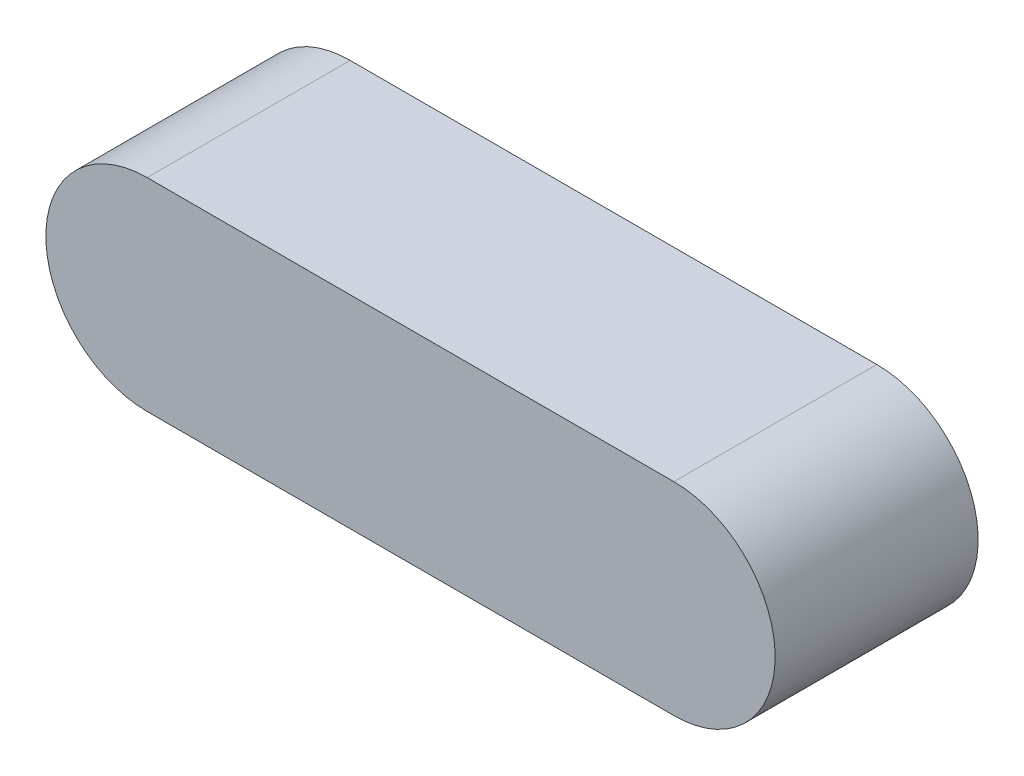
ISO-10303-21;
HEADER;
FILE_DESCRIPTION(('STEP AP214'),'2;1');
FILE_NAME('part.step','',(''),(''),'','','');
FILE_SCHEMA(('AUTOMOTIVE_DESIGN { 1 0 10303 214 1 1 1 1 }'));
ENDSEC;
DATA;
#1=APPLICATION_CONTEXT('core data for automotive mechanical design processes');
#2=APPLICATION_PROTOCOL_DEFINITION('international standard','automotive_design',2000,#1);
#3=PRODUCT_CONTEXT('',#1,'mechanical');
#4=PRODUCT('Part','Part','',(#3));
#5=PRODUCT_RELATED_PRODUCT_CATEGORY('part','',(#4));
#6=PRODUCT_DEFINITION_FORMATION('','',#4);
#7=PRODUCT_DEFINITION_CONTEXT('part definition',#1,'design');
#8=PRODUCT_DEFINITION('design','',#6,#7);
#9=PRODUCT_DEFINITION_SHAPE('','',#8);
#10=(LENGTH_UNIT() NAMED_UNIT(*) SI_UNIT(.MILLI.,.METRE.));
#11=(NAMED_UNIT(*) PLANE_ANGLE_UNIT() SI_UNIT($,.RADIAN.));
#12=(NAMED_UNIT(*) SI_UNIT($,.STERADIAN.) SOLID_ANGLE_UNIT());
#13=UNCERTAINTY_MEASURE_WITH_UNIT(LENGTH_MEASURE(1.E-05),#10,'distance_accuracy_value','');
#14=(GEOMETRIC_REPRESENTATION_CONTEXT(3) GLOBAL_UNCERTAINTY_ASSIGNED_CONTEXT((#13)) GLOBAL_UNIT_ASSIGNED_CONTEXT((#10,
#11,#12)) REPRESENTATION_CONTEXT('',''));
#15=CARTESIAN_POINT('',(0.,0.,0.));
#16=DIRECTION('',(0.,0.,1.));
#17=DIRECTION('',(1.,0.,0.));
#18=AXIS2_PLACEMENT_3D('',#15,#16,#17);
#19=CARTESIAN_POINT('',(-32.5,0.,25.05));
#20=DIRECTION('',(0.,0.,-1.));
#21=DIRECTION('',(-1.,0.,0.));
#22=AXIS2_PLACEMENT_3D('',#19,#20,#21);
#23=CYLINDRICAL_SURFACE('',#22,12.5);
#24=CARTESIAN_POINT('',(-32.5,0.,0.));
#25=DIRECTION('',(0.,0.,1.));
#26=DIRECTION('',(1.,0.,0.));
#27=AXIS2_PLACEMENT_3D('',#24,#25,#26);
#28=CIRCLE('',#27,12.5);
#29=CARTESIAN_POINT('',(-32.5,12.5,0.));
#30=VERTEX_POINT('',#29);
#31=CARTESIAN_POINT('',(-32.5,-12.5,0.));
#32=VERTEX_POINT('',#31);
#33=EDGE_CURVE('E100',#30,#32,#28,.T.);
#34=ORIENTED_EDGE('',*,*,#33,.T.);
#35=DIRECTION('',(0.,0.,-1.));
#36=VECTOR('',#35,1.);
#37=CARTESIAN_POINT('',(-32.5,-12.5,25.05));
#38=LINE('',#37,#36);
#39=CARTESIAN_POINT('',(-32.5,-12.5,25.05));
#40=VERTEX_POINT('',#39);
#41=EDGE_CURVE('E11',#40,#32,#38,.T.);
#42=ORIENTED_EDGE('',*,*,#41,.F.);
#43=CARTESIAN_POINT('',(-32.5,0.,25.05));
#44=DIRECTION('',(0.,0.,1.));
#45=DIRECTION('',(1.,0.,0.));
#46=AXIS2_PLACEMENT_3D('',#43,#44,#45);
#47=CIRCLE('',#46,12.5);
#48=CARTESIAN_POINT('',(-32.5,12.5,25.05));
#49=VERTEX_POINT('',#48);
#50=EDGE_CURVE('E88',#49,#40,#47,.T.);
#51=ORIENTED_EDGE('',*,*,#50,.F.);
#52=DIRECTION('',(0.,0.,-1.));
#53=VECTOR('',#52,1.);
#54=CARTESIAN_POINT('',(-32.5,12.5,25.05));
#55=LINE('',#54,#53);
#56=EDGE_CURVE('E96',#49,#30,#55,.T.);
#57=ORIENTED_EDGE('',*,*,#56,.T.);
#58=EDGE_LOOP('',(#34,#42,#51,#57));
#59=FACE_BOUND('',#58,.T.);
#60=ADVANCED_FACE('F37',(#59),#23,.T.);
#61=CARTESIAN_POINT('',(-32.5,-12.5,25.05));
#62=DIRECTION('',(0.,1.,0.));
#63=DIRECTION('',(0.,0.,1.));
#64=AXIS2_PLACEMENT_3D('',#61,#62,#63);
#65=PLANE('',#64);
#66=DIRECTION('',(1.,0.,0.));
#67=VECTOR('',#66,1.);
#68=CARTESIAN_POINT('',(-32.5,-12.5,0.));
#69=LINE('',#68,#67);
#70=CARTESIAN_POINT('',(32.5,-12.5,0.));
#71=VERTEX_POINT('',#70);
#72=EDGE_CURVE('E92',#32,#71,#69,.T.);
#73=ORIENTED_EDGE('',*,*,#72,.T.);
#74=DIRECTION('',(0.,0.,-1.));
#75=VECTOR('',#74,1.);
#76=CARTESIAN_POINT('',(32.5,-12.5,25.05));
#77=LINE('',#76,#75);
#78=CARTESIAN_POINT('',(32.5,-12.5,25.05));
#79=VERTEX_POINT('',#78);
#80=EDGE_CURVE('E45',#79,#71,#77,.T.);
#81=ORIENTED_EDGE('',*,*,#80,.F.);
#82=DIRECTION('',(1.,0.,0.));
#83=VECTOR('',#82,1.);
#84=CARTESIAN_POINT('',(-32.5,-12.5,25.05));
#85=LINE('',#84,#83);
#86=EDGE_CURVE('E83',#40,#79,#85,.T.);
#87=ORIENTED_EDGE('',*,*,#86,.F.);
#88=ORIENTED_EDGE('',*,*,#41,.T.);
#89=EDGE_LOOP('',(#73,#81,#87,#88));
#90=FACE_BOUND('',#89,.T.);
#91=ADVANCED_FACE('F91',(#90),#65,.F.);
#92=CARTESIAN_POINT('',(32.5,0.,25.05));
#93=DIRECTION('',(0.,0.,-1.));
#94=DIRECTION('',(-1.,0.,0.));
#95=AXIS2_PLACEMENT_3D('',#92,#93,#94);
#96=CYLINDRICAL_SURFACE('',#95,12.5);
#97=CARTESIAN_POINT('',(32.5,0.,0.));
#98=DIRECTION('',(0.,0.,1.));
#99=DIRECTION('',(1.,0.,0.));
#100=AXIS2_PLACEMENT_3D('',#97,#98,#99);
#101=CIRCLE('',#100,12.5);
#102=CARTESIAN_POINT('',(32.5,12.5,0.));
#103=VERTEX_POINT('',#102);
#104=EDGE_CURVE('E70',#71,#103,#101,.T.);
#105=ORIENTED_EDGE('',*,*,#104,.T.);
#106=DIRECTION('',(0.,0.,-1.));
#107=VECTOR('',#106,1.);
#108=CARTESIAN_POINT('',(32.5,12.5,25.05));
#109=LINE('',#108,#107);
#110=CARTESIAN_POINT('',(32.5,12.5,25.05));
#111=VERTEX_POINT('',#110);
#112=EDGE_CURVE('E93',#111,#103,#109,.T.);
#113=ORIENTED_EDGE('',*,*,#112,.F.);
#114=CARTESIAN_POINT('',(32.5,0.,25.05));
#115=DIRECTION('',(0.,0.,1.));
#116=DIRECTION('',(1.,0.,0.));
#117=AXIS2_PLACEMENT_3D('',#114,#115,#116);
#118=CIRCLE('',#117,12.5);
#119=EDGE_CURVE('E86',#79,#111,#118,.T.);
#120=ORIENTED_EDGE('',*,*,#119,.F.);
#121=ORIENTED_EDGE('',*,*,#80,.T.);
#122=EDGE_LOOP('',(#105,#113,#120,#121));
#123=FACE_BOUND('',#122,.T.);
#124=ADVANCED_FACE('F94',(#123),#96,.T.);
#125=CARTESIAN_POINT('',(-32.5,12.5,25.05));
#126=DIRECTION('',(0.,-1.,0.));
#127=DIRECTION('',(0.,0.,-1.));
#128=AXIS2_PLACEMENT_3D('',#125,#126,#127);
#129=PLANE('',#128);
#130=DIRECTION('',(-1.,0.,0.));
#131=VECTOR('',#130,1.);
#132=CARTESIAN_POINT('',(-32.5,12.5,0.));
#133=LINE('',#132,#131);
#134=EDGE_CURVE('E76',#103,#30,#133,.T.);
#135=ORIENTED_EDGE('',*,*,#134,.T.);
#136=ORIENTED_EDGE('',*,*,#56,.F.);
#137=DIRECTION('',(-1.,0.,0.));
#138=VECTOR('',#137,1.);
#139=CARTESIAN_POINT('',(-32.5,12.5,25.05));
#140=LINE('',#139,#138);
#141=EDGE_CURVE('E53',#111,#49,#140,.T.);
#142=ORIENTED_EDGE('',*,*,#141,.F.);
#143=ORIENTED_EDGE('',*,*,#112,.T.);
#144=EDGE_LOOP('',(#135,#136,#142,#143));
#145=FACE_BOUND('',#144,.T.);
#146=ADVANCED_FACE('F108',(#145),#129,.F.);
#147=CARTESIAN_POINT('',(-32.5,0.,25.05));
#148=DIRECTION('',(0.,0.,1.));
#149=DIRECTION('',(1.,0.,0.));
#150=AXIS2_PLACEMENT_3D('',#147,#148,#149);
#151=PLANE('',#150);
#152=ORIENTED_EDGE('',*,*,#50,.T.);
#153=ORIENTED_EDGE('',*,*,#86,.T.);
#154=ORIENTED_EDGE('',*,*,#119,.T.);
#155=ORIENTED_EDGE('',*,*,#141,.T.);
#156=EDGE_LOOP('',(#152,#153,#154,#155));
#157=FACE_BOUND('',#156,.T.);
#158=ADVANCED_FACE('F84',(#157),#151,.T.);
#159=CARTESIAN_POINT('',(-32.5,0.,0.));
#160=DIRECTION('',(0.,0.,1.));
#161=DIRECTION('',(1.,0.,0.));
#162=AXIS2_PLACEMENT_3D('',#159,#160,#161);
#163=PLANE('',#162);
#164=CARTESIAN_POINT('',(22.5,0.,0.));
#165=DIRECTION('',(0.,0.,-1.));
#166=DIRECTION('',(-1.,0.,0.));
#167=AXIS2_PLACEMENT_3D('',#164,#165,#166);
#168=CIRCLE('',#167,1.5);
#169=CARTESIAN_POINT('',(21.,0.,0.));
#170=VERTEX_POINT('',#169);
#171=EDGE_CURVE('E120',#170,#170,#168,.T.);
#172=ORIENTED_EDGE('',*,*,#171,.F.);
#173=EDGE_LOOP('',(#172));
#174=FACE_BOUND('',#173,.T.);
#175=CARTESIAN_POINT('',(-22.5,0.,0.));
#176=DIRECTION('',(0.,0.,-1.));
#177=DIRECTION('',(-1.,0.,0.));
#178=AXIS2_PLACEMENT_3D('',#175,#176,#177);
#179=CIRCLE('',#178,1.5);
#180=CARTESIAN_POINT('',(-24.,0.,0.));
#181=VERTEX_POINT('',#180);
#182=EDGE_CURVE('E117',#181,#181,#179,.T.);
#183=ORIENTED_EDGE('',*,*,#182,.F.);
#184=EDGE_LOOP('',(#183));
#185=FACE_BOUND('',#184,.T.);
#186=ORIENTED_EDGE('',*,*,#33,.F.);
#187=ORIENTED_EDGE('',*,*,#134,.F.);
#188=ORIENTED_EDGE('',*,*,#104,.F.);
#189=ORIENTED_EDGE('',*,*,#72,.F.);
#190=EDGE_LOOP('',(#186,#187,#188,#189));
#191=FACE_BOUND('',#190,.T.);
#192=ADVANCED_FACE('F111',(#174,#185,#191),#163,.F.);
#193=CARTESIAN_POINT('',(-22.5,0.,3.));
#194=DIRECTION('',(0.,0.,-1.));
#195=DIRECTION('',(-1.,0.,0.));
#196=AXIS2_PLACEMENT_3D('',#193,#194,#195);
#197=CYLINDRICAL_SURFACE('',#196,1.5);
#198=CARTESIAN_POINT('',(-22.5,0.,3.));
#199=DIRECTION('',(0.,0.,-1.));
#200=DIRECTION('',(-1.,0.,0.));
#201=AXIS2_PLACEMENT_3D('',#198,#199,#200);
#202=CIRCLE('',#201,1.5);
#203=CARTESIAN_POINT('',(-24.,0.,3.));
#204=VERTEX_POINT('',#203);
#205=EDGE_CURVE('E114',#204,#204,#202,.T.);
#206=ORIENTED_EDGE('',*,*,#205,.F.);
#207=EDGE_LOOP('',(#206));
#208=FACE_BOUND('',#207,.T.);
#209=ORIENTED_EDGE('',*,*,#182,.T.);
#210=EDGE_LOOP('',(#209));
#211=FACE_BOUND('',#210,.T.);
#212=ADVANCED_FACE('F137',(#208,#211),#197,.F.);
#213=CARTESIAN_POINT('',(-22.5,0.,3.));
#214=DIRECTION('',(0.,0.,-1.));
#215=DIRECTION('',(-1.,0.,0.));
#216=AXIS2_PLACEMENT_3D('',#213,#214,#215);
#217=PLANE('',#216);
#218=ORIENTED_EDGE('',*,*,#205,.T.);
#219=EDGE_LOOP('',(#218));
#220=FACE_BOUND('',#219,.T.);
#221=ADVANCED_FACE('F131',(#220),#217,.T.);
#222=CARTESIAN_POINT('',(22.5,0.,3.));
#223=DIRECTION('',(0.,0.,-1.));
#224=DIRECTION('',(-1.,0.,0.));
#225=AXIS2_PLACEMENT_3D('',#222,#223,#224);
#226=CYLINDRICAL_SURFACE('',#225,1.5);
#227=CARTESIAN_POINT('',(22.5,0.,3.));
#228=DIRECTION('',(0.,0.,-1.));
#229=DIRECTION('',(-1.,0.,0.));
#230=AXIS2_PLACEMENT_3D('',#227,#228,#229);
#231=CIRCLE('',#230,1.5);
#232=CARTESIAN_POINT('',(21.,0.,3.));
#233=VERTEX_POINT('',#232);
#234=EDGE_CURVE('E103',#233,#233,#231,.T.);
#235=ORIENTED_EDGE('',*,*,#234,.F.);
#236=EDGE_LOOP('',(#235));
#237=FACE_BOUND('',#236,.T.);
#238=ORIENTED_EDGE('',*,*,#171,.T.);
#239=EDGE_LOOP('',(#238));
#240=FACE_BOUND('',#239,.T.);
#241=ADVANCED_FACE('F128',(#237,#240),#226,.F.);
#242=CARTESIAN_POINT('',(22.5,0.,3.));
#243=DIRECTION('',(0.,0.,-1.));
#244=DIRECTION('',(-1.,0.,0.));
#245=AXIS2_PLACEMENT_3D('',#242,#243,#244);
#246=PLANE('',#245);
#247=ORIENTED_EDGE('',*,*,#234,.T.);
#248=EDGE_LOOP('',(#247));
#249=FACE_BOUND('',#248,.T.);
#250=ADVANCED_FACE('F126',(#249),#246,.T.);
#251=CLOSED_SHELL('',(#60,#91,#124,#146,#158,#192,#212,#221,#241,#250));
#252=MANIFOLD_SOLID_BREP('B2',#251);
#253=ADVANCED_BREP_SHAPE_REPRESENTATION('',(#18,#252),#14);
#254=SHAPE_DEFINITION_REPRESENTATION(#9,#253);
ENDSEC;
END-ISO-10303-21;
